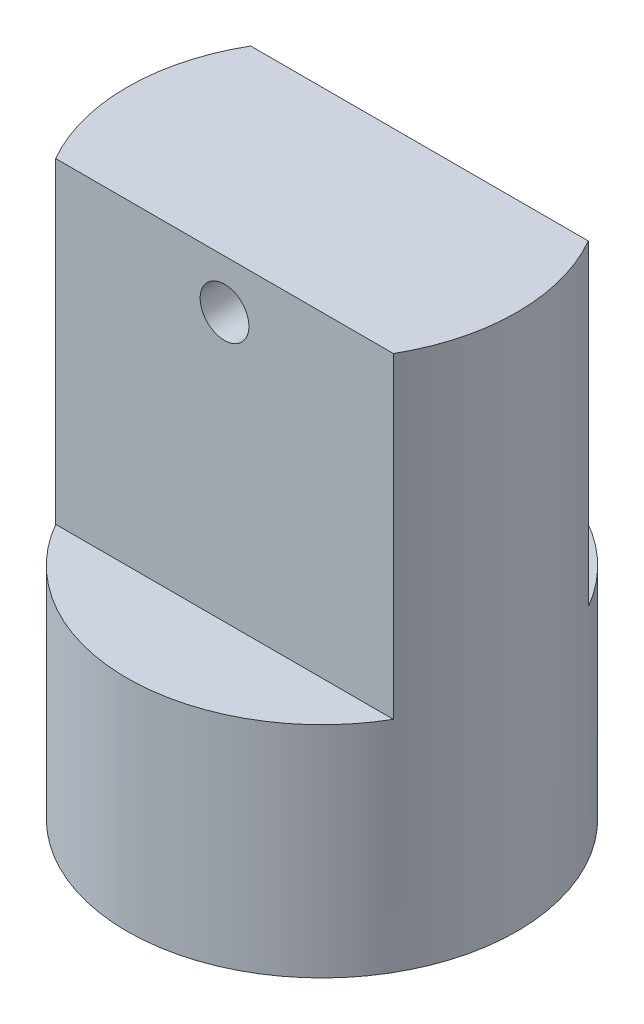
ISO-10303-21;
HEADER;
FILE_DESCRIPTION(('STEP AP214'),'2;1');
FILE_NAME('part.step','',(''),(''),'','','');
FILE_SCHEMA(('AUTOMOTIVE_DESIGN { 1 0 10303 214 1 1 1 1 }'));
ENDSEC;
DATA;
#1=APPLICATION_CONTEXT('core data for automotive mechanical design processes');
#2=APPLICATION_PROTOCOL_DEFINITION('international standard','automotive_design',2000,#1);
#3=PRODUCT_CONTEXT('',#1,'mechanical');
#4=PRODUCT('Part','Part','',(#3));
#5=PRODUCT_RELATED_PRODUCT_CATEGORY('part','',(#4));
#6=PRODUCT_DEFINITION_FORMATION('','',#4);
#7=PRODUCT_DEFINITION_CONTEXT('part definition',#1,'design');
#8=PRODUCT_DEFINITION('design','',#6,#7);
#9=PRODUCT_DEFINITION_SHAPE('','',#8);
#10=(LENGTH_UNIT() NAMED_UNIT(*) SI_UNIT(.MILLI.,.METRE.));
#11=(NAMED_UNIT(*) PLANE_ANGLE_UNIT() SI_UNIT($,.RADIAN.));
#12=(NAMED_UNIT(*) SI_UNIT($,.STERADIAN.) SOLID_ANGLE_UNIT());
#13=UNCERTAINTY_MEASURE_WITH_UNIT(LENGTH_MEASURE(1.E-05),#10,'distance_accuracy_value','');
#14=(GEOMETRIC_REPRESENTATION_CONTEXT(3) GLOBAL_UNCERTAINTY_ASSIGNED_CONTEXT((#13)) GLOBAL_UNIT_ASSIGNED_CONTEXT((#10,
#11,#12)) REPRESENTATION_CONTEXT('',''));
#15=CARTESIAN_POINT('',(0.,0.,0.));
#16=DIRECTION('',(0.,0.,1.));
#17=DIRECTION('',(1.,0.,0.));
#18=AXIS2_PLACEMENT_3D('',#15,#16,#17);
#19=CARTESIAN_POINT('',(0.,139.7,0.));
#20=DIRECTION('',(0.,-1.,0.));
#21=DIRECTION('',(0.,0.,-1.));
#22=AXIS2_PLACEMENT_3D('',#19,#20,#21);
#23=CYLINDRICAL_SURFACE('',#22,50.8);
#24=CARTESIAN_POINT('',(0.,0.,0.));
#25=DIRECTION('',(0.,1.,0.));
#26=DIRECTION('',(0.,0.,1.));
#27=AXIS2_PLACEMENT_3D('',#24,#25,#26);
#28=CIRCLE('',#27,50.8);
#29=CARTESIAN_POINT('',(0.,0.,50.8));
#30=VERTEX_POINT('',#29);
#31=EDGE_CURVE('E108',#30,#30,#28,.T.);
#32=ORIENTED_EDGE('',*,*,#31,.T.);
#33=EDGE_LOOP('',(#32));
#34=FACE_BOUND('',#33,.T.);
#35=CARTESIAN_POINT('',(0.,139.7,0.));
#36=DIRECTION('',(0.,1.,0.));
#37=DIRECTION('',(0.,0.,1.));
#38=AXIS2_PLACEMENT_3D('',#35,#36,#37);
#39=CIRCLE('',#38,50.8);
#40=CARTESIAN_POINT('',(-43.9940905122495,139.7,-25.4));
#41=VERTEX_POINT('',#40);
#42=CARTESIAN_POINT('',(-43.9940905122495,139.7,25.4));
#43=VERTEX_POINT('',#42);
#44=EDGE_CURVE('E94',#41,#43,#39,.T.);
#45=ORIENTED_EDGE('',*,*,#44,.F.);
#46=DIRECTION('',(0.,-1.,0.));
#47=VECTOR('',#46,1.);
#48=CARTESIAN_POINT('',(-43.9940905122495,139.7,-25.4));
#49=LINE('',#48,#47);
#50=CARTESIAN_POINT('',(-43.9940905122495,57.15,-25.4));
#51=VERTEX_POINT('',#50);
#52=EDGE_CURVE('E55',#41,#51,#49,.T.);
#53=ORIENTED_EDGE('',*,*,#52,.T.);
#54=CARTESIAN_POINT('',(0.,57.15,0.));
#55=DIRECTION('',(0.,-1.,0.));
#56=DIRECTION('',(0.,0.,-1.));
#57=AXIS2_PLACEMENT_3D('',#54,#55,#56);
#58=CIRCLE('',#57,50.8);
#59=CARTESIAN_POINT('',(43.9940905122495,57.15,-25.4));
#60=VERTEX_POINT('',#59);
#61=EDGE_CURVE('E11',#51,#60,#58,.T.);
#62=ORIENTED_EDGE('',*,*,#61,.T.);
#63=DIRECTION('',(0.,-1.,0.));
#64=VECTOR('',#63,1.);
#65=CARTESIAN_POINT('',(43.9940905122495,139.7,-25.4));
#66=LINE('',#65,#64);
#67=CARTESIAN_POINT('',(43.9940905122495,139.7,-25.4));
#68=VERTEX_POINT('',#67);
#69=EDGE_CURVE('E88',#60,#68,#66,.F.);
#70=ORIENTED_EDGE('',*,*,#69,.T.);
#71=CARTESIAN_POINT('',(43.9940905122495,139.7,25.4));
#72=VERTEX_POINT('',#71);
#73=EDGE_CURVE('E109',#72,#68,#39,.T.);
#74=ORIENTED_EDGE('',*,*,#73,.F.);
#75=DIRECTION('',(0.,-1.,0.));
#76=VECTOR('',#75,1.);
#77=CARTESIAN_POINT('',(43.9940905122495,139.7,25.4));
#78=LINE('',#77,#76);
#79=CARTESIAN_POINT('',(43.9940905122495,57.15,25.4));
#80=VERTEX_POINT('',#79);
#81=EDGE_CURVE('E63',#80,#72,#78,.F.);
#82=ORIENTED_EDGE('',*,*,#81,.F.);
#83=CARTESIAN_POINT('',(0.,57.15,0.));
#84=DIRECTION('',(0.,1.,0.));
#85=DIRECTION('',(0.,0.,1.));
#86=AXIS2_PLACEMENT_3D('',#83,#84,#85);
#87=CIRCLE('',#86,50.8);
#88=CARTESIAN_POINT('',(-43.9940905122495,57.15,25.4));
#89=VERTEX_POINT('',#88);
#90=EDGE_CURVE('E119',#89,#80,#87,.T.);
#91=ORIENTED_EDGE('',*,*,#90,.F.);
#92=DIRECTION('',(0.,-1.,0.));
#93=VECTOR('',#92,1.);
#94=CARTESIAN_POINT('',(-43.9940905122495,139.7,25.4));
#95=LINE('',#94,#93);
#96=EDGE_CURVE('E105',#43,#89,#95,.T.);
#97=ORIENTED_EDGE('',*,*,#96,.F.);
#98=EDGE_LOOP('',(#45,#53,#62,#70,#74,#82,#91,#97));
#99=FACE_BOUND('',#98,.T.);
#100=ADVANCED_FACE('F39',(#34,#99),#23,.T.);
#101=CARTESIAN_POINT('',(0.,139.7,0.));
#102=DIRECTION('',(0.,1.,0.));
#103=DIRECTION('',(0.,0.,1.));
#104=AXIS2_PLACEMENT_3D('',#101,#102,#103);
#105=PLANE('',#104);
#106=DIRECTION('',(1.,0.,0.));
#107=VECTOR('',#106,1.);
#108=CARTESIAN_POINT('',(0.,139.7,-25.4));
#109=LINE('',#108,#107);
#110=EDGE_CURVE('E48',#41,#68,#109,.T.);
#111=ORIENTED_EDGE('',*,*,#110,.F.);
#112=ORIENTED_EDGE('',*,*,#44,.T.);
#113=DIRECTION('',(1.,0.,0.));
#114=VECTOR('',#113,1.);
#115=CARTESIAN_POINT('',(0.,139.7,25.4));
#116=LINE('',#115,#114);
#117=EDGE_CURVE('E113',#43,#72,#116,.T.);
#118=ORIENTED_EDGE('',*,*,#117,.T.);
#119=ORIENTED_EDGE('',*,*,#73,.T.);
#120=EDGE_LOOP('',(#111,#112,#118,#119));
#121=FACE_BOUND('',#120,.T.);
#122=ADVANCED_FACE('F125',(#121),#105,.T.);
#123=CARTESIAN_POINT('',(0.,0.,0.));
#124=DIRECTION('',(0.,1.,0.));
#125=DIRECTION('',(0.,0.,1.));
#126=AXIS2_PLACEMENT_3D('',#123,#124,#125);
#127=PLANE('',#126);
#128=CARTESIAN_POINT('',(0.,0.,0.));
#129=DIRECTION('',(0.,-1.,0.));
#130=DIRECTION('',(0.,0.,-1.));
#131=AXIS2_PLACEMENT_3D('',#128,#129,#130);
#132=CIRCLE('',#131,6.35);
#133=CARTESIAN_POINT('',(0.,0.,-6.35));
#134=VERTEX_POINT('',#133);
#135=EDGE_CURVE('E218',#134,#134,#132,.T.);
#136=ORIENTED_EDGE('',*,*,#135,.F.);
#137=EDGE_LOOP('',(#136));
#138=FACE_BOUND('',#137,.T.);
#139=ORIENTED_EDGE('',*,*,#31,.F.);
#140=EDGE_LOOP('',(#139));
#141=FACE_BOUND('',#140,.T.);
#142=ADVANCED_FACE('F132',(#138,#141),#127,.F.);
#143=CARTESIAN_POINT('',(-50.8,57.15,76.2));
#144=DIRECTION('',(0.,1.,0.));
#145=DIRECTION('',(0.,0.,1.));
#146=AXIS2_PLACEMENT_3D('',#143,#144,#145);
#147=PLANE('',#146);
#148=ORIENTED_EDGE('',*,*,#90,.T.);
#149=DIRECTION('',(1.,0.,0.));
#150=VECTOR('',#149,1.);
#151=CARTESIAN_POINT('',(-50.8,57.15,25.4));
#152=LINE('',#151,#150);
#153=EDGE_CURVE('E96',#89,#80,#152,.T.);
#154=ORIENTED_EDGE('',*,*,#153,.F.);
#155=EDGE_LOOP('',(#148,#154));
#156=FACE_BOUND('',#155,.T.);
#157=ADVANCED_FACE('F130',(#156),#147,.T.);
#158=CARTESIAN_POINT('',(0.,0.,25.4));
#159=DIRECTION('',(0.,0.,1.));
#160=DIRECTION('',(1.,0.,0.));
#161=AXIS2_PLACEMENT_3D('',#158,#159,#160);
#162=PLANE('',#161);
#163=CARTESIAN_POINT('',(0.,127.,25.4));
#164=DIRECTION('',(0.,0.,1.));
#165=DIRECTION('',(1.,0.,0.));
#166=AXIS2_PLACEMENT_3D('',#163,#164,#165);
#167=CIRCLE('',#166,6.35);
#168=CARTESIAN_POINT('',(6.35,127.,25.4));
#169=VERTEX_POINT('',#168);
#170=EDGE_CURVE('E214',#169,#169,#167,.T.);
#171=ORIENTED_EDGE('',*,*,#170,.F.);
#172=EDGE_LOOP('',(#171));
#173=FACE_BOUND('',#172,.T.);
#174=ORIENTED_EDGE('',*,*,#96,.T.);
#175=ORIENTED_EDGE('',*,*,#153,.T.);
#176=ORIENTED_EDGE('',*,*,#81,.T.);
#177=ORIENTED_EDGE('',*,*,#117,.F.);
#178=EDGE_LOOP('',(#174,#175,#176,#177));
#179=FACE_BOUND('',#178,.T.);
#180=ADVANCED_FACE('F126',(#173,#179),#162,.T.);
#181=CARTESIAN_POINT('',(-50.8,57.15,-76.2));
#182=DIRECTION('',(0.,-1.,0.));
#183=DIRECTION('',(0.,0.,-1.));
#184=AXIS2_PLACEMENT_3D('',#181,#182,#183);
#185=PLANE('',#184);
#186=DIRECTION('',(1.,0.,0.));
#187=VECTOR('',#186,1.);
#188=CARTESIAN_POINT('',(-50.8,57.15,-25.4));
#189=LINE('',#188,#187);
#190=EDGE_CURVE('E84',#51,#60,#189,.T.);
#191=ORIENTED_EDGE('',*,*,#190,.T.);
#192=ORIENTED_EDGE('',*,*,#61,.F.);
#193=EDGE_LOOP('',(#191,#192));
#194=FACE_BOUND('',#193,.T.);
#195=ADVANCED_FACE('F83',(#194),#185,.F.);
#196=CARTESIAN_POINT('',(0.,0.,-25.4));
#197=DIRECTION('',(0.,0.,1.));
#198=DIRECTION('',(1.,0.,0.));
#199=AXIS2_PLACEMENT_3D('',#196,#197,#198);
#200=PLANE('',#199);
#201=CARTESIAN_POINT('',(0.,127.,-25.4));
#202=DIRECTION('',(0.,0.,1.));
#203=DIRECTION('',(1.,0.,0.));
#204=AXIS2_PLACEMENT_3D('',#201,#202,#203);
#205=CIRCLE('',#204,6.35);
#206=CARTESIAN_POINT('',(6.35,127.,-25.4));
#207=VERTEX_POINT('',#206);
#208=EDGE_CURVE('E42',#207,#207,#205,.T.);
#209=ORIENTED_EDGE('',*,*,#208,.T.);
#210=EDGE_LOOP('',(#209));
#211=FACE_BOUND('',#210,.T.);
#212=ORIENTED_EDGE('',*,*,#110,.T.);
#213=ORIENTED_EDGE('',*,*,#69,.F.);
#214=ORIENTED_EDGE('',*,*,#190,.F.);
#215=ORIENTED_EDGE('',*,*,#52,.F.);
#216=EDGE_LOOP('',(#212,#213,#214,#215));
#217=FACE_BOUND('',#216,.T.);
#218=ADVANCED_FACE('F87',(#211,#217),#200,.F.);
#219=CARTESIAN_POINT('',(0.,25.4,0.));
#220=DIRECTION('',(0.,-1.,0.));
#221=DIRECTION('',(0.,0.,-1.));
#222=AXIS2_PLACEMENT_3D('',#219,#220,#221);
#223=CYLINDRICAL_SURFACE('',#222,6.35);
#224=CARTESIAN_POINT('',(0.,25.4,0.));
#225=DIRECTION('',(0.,-1.,0.));
#226=DIRECTION('',(0.,0.,-1.));
#227=AXIS2_PLACEMENT_3D('',#224,#225,#226);
#228=CIRCLE('',#227,6.35);
#229=CARTESIAN_POINT('',(0.,25.4,-6.35));
#230=VERTEX_POINT('',#229);
#231=EDGE_CURVE('E90',#230,#230,#228,.T.);
#232=ORIENTED_EDGE('',*,*,#231,.F.);
#233=EDGE_LOOP('',(#232));
#234=FACE_BOUND('',#233,.T.);
#235=ORIENTED_EDGE('',*,*,#135,.T.);
#236=EDGE_LOOP('',(#235));
#237=FACE_BOUND('',#236,.T.);
#238=ADVANCED_FACE('F164',(#234,#237),#223,.F.);
#239=CARTESIAN_POINT('',(0.,25.4,0.));
#240=DIRECTION('',(0.,-1.,0.));
#241=DIRECTION('',(0.,0.,-1.));
#242=AXIS2_PLACEMENT_3D('',#239,#240,#241);
#243=PLANE('',#242);
#244=ORIENTED_EDGE('',*,*,#231,.T.);
#245=EDGE_LOOP('',(#244));
#246=FACE_BOUND('',#245,.T.);
#247=ADVANCED_FACE('F169',(#246),#243,.T.);
#248=CARTESIAN_POINT('',(0.,127.,-50.8));
#249=DIRECTION('',(0.,0.,1.));
#250=DIRECTION('',(1.,0.,0.));
#251=AXIS2_PLACEMENT_3D('',#248,#249,#250);
#252=CYLINDRICAL_SURFACE('',#251,6.35);
#253=ORIENTED_EDGE('',*,*,#170,.T.);
#254=EDGE_LOOP('',(#253));
#255=FACE_BOUND('',#254,.T.);
#256=ORIENTED_EDGE('',*,*,#208,.F.);
#257=EDGE_LOOP('',(#256));
#258=FACE_BOUND('',#257,.T.);
#259=ADVANCED_FACE('F181',(#255,#258),#252,.F.);
#260=CLOSED_SHELL('',(#100,#122,#142,#157,#180,#195,#218,#238,#247,#259));
#261=MANIFOLD_SOLID_BREP('B2',#260);
#262=ADVANCED_BREP_SHAPE_REPRESENTATION('',(#18,#261),#14);
#263=SHAPE_DEFINITION_REPRESENTATION(#9,#262);
ENDSEC;
END-ISO-10303-21;
